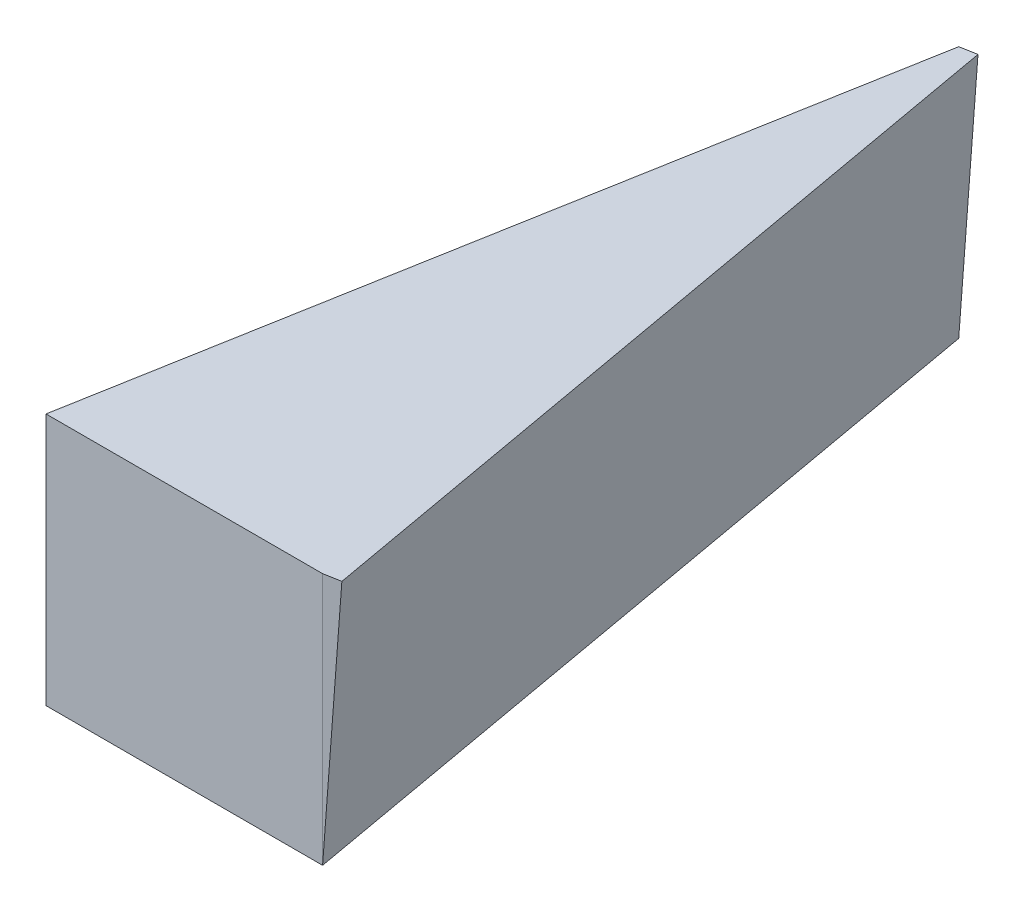
ISO-10303-21;
HEADER;
FILE_DESCRIPTION(('STEP AP214'),'2;1');
FILE_NAME('part.step','',(''),(''),'','','');
FILE_SCHEMA(('AUTOMOTIVE_DESIGN { 1 0 10303 214 1 1 1 1 }'));
ENDSEC;
DATA;
#1=APPLICATION_CONTEXT('core data for automotive mechanical design processes');
#2=APPLICATION_PROTOCOL_DEFINITION('international standard','automotive_design',2000,#1);
#3=PRODUCT_CONTEXT('',#1,'mechanical');
#4=PRODUCT('Part','Part','',(#3));
#5=PRODUCT_RELATED_PRODUCT_CATEGORY('part','',(#4));
#6=PRODUCT_DEFINITION_FORMATION('','',#4);
#7=PRODUCT_DEFINITION_CONTEXT('part definition',#1,'design');
#8=PRODUCT_DEFINITION('design','',#6,#7);
#9=PRODUCT_DEFINITION_SHAPE('','',#8);
#10=(LENGTH_UNIT() NAMED_UNIT(*) SI_UNIT(.MILLI.,.METRE.));
#11=(NAMED_UNIT(*) PLANE_ANGLE_UNIT() SI_UNIT($,.RADIAN.));
#12=(NAMED_UNIT(*) SI_UNIT($,.STERADIAN.) SOLID_ANGLE_UNIT());
#13=UNCERTAINTY_MEASURE_WITH_UNIT(LENGTH_MEASURE(1.E-05),#10,'distance_accuracy_value','');
#14=(GEOMETRIC_REPRESENTATION_CONTEXT(3) GLOBAL_UNCERTAINTY_ASSIGNED_CONTEXT((#13)) GLOBAL_UNIT_ASSIGNED_CONTEXT((#10,
#11,#12)) REPRESENTATION_CONTEXT('',''));
#15=CARTESIAN_POINT('',(0.,0.,0.));
#16=DIRECTION('',(0.,0.,1.));
#17=DIRECTION('',(1.,0.,0.));
#18=AXIS2_PLACEMENT_3D('',#15,#16,#17);
#19=CARTESIAN_POINT('',(0.,-65.09,0.));
#20=DIRECTION('',(0.,-1.,0.));
#21=DIRECTION('',(0.,0.,-1.));
#22=AXIS2_PLACEMENT_3D('',#19,#20,#21);
#23=PLANE('',#22);
#24=DIRECTION('',(-0.175798016675712,0.,-0.984426257945656));
#25=VECTOR('',#24,1.);
#26=CARTESIAN_POINT('',(71.265,-65.09,399.06671644601));
#27=LINE('',#26,#25);
#28=CARTESIAN_POINT('',(71.265,-65.09,399.06671644601));
#29=VERTEX_POINT('',#28);
#30=CARTESIAN_POINT('',(0.,-65.09,0.));
#31=VERTEX_POINT('',#30);
#32=EDGE_CURVE('E121',#29,#31,#27,.T.);
#33=ORIENTED_EDGE('',*,*,#32,.F.);
#34=DIRECTION('',(1.,0.,0.));
#35=VECTOR('',#34,1.);
#36=CARTESIAN_POINT('',(-71.265,-65.09,399.06671644601));
#37=LINE('',#36,#35);
#38=CARTESIAN_POINT('',(-71.265,-65.09,399.06671644601));
#39=VERTEX_POINT('',#38);
#40=EDGE_CURVE('E137',#39,#29,#37,.T.);
#41=ORIENTED_EDGE('',*,*,#40,.F.);
#42=DIRECTION('',(-0.175798016675712,0.,0.984426257945656));
#43=VECTOR('',#42,1.);
#44=CARTESIAN_POINT('',(0.,-65.09,0.));
#45=LINE('',#44,#43);
#46=EDGE_CURVE('E66',#31,#39,#45,.T.);
#47=ORIENTED_EDGE('',*,*,#46,.F.);
#48=EDGE_LOOP('',(#33,#41,#47));
#49=FACE_BOUND('',#48,.T.);
#50=DIRECTION('',(1.,0.,0.));
#51=VECTOR('',#50,1.);
#52=CARTESIAN_POINT('',(0.,-65.09,394.06671644601));
#53=LINE('',#52,#51);
#54=CARTESIAN_POINT('',(-65.2930035849032,-65.09,394.06671644601));
#55=VERTEX_POINT('',#54);
#56=CARTESIAN_POINT('',(65.2930035849032,-65.09,394.06671644601));
#57=VERTEX_POINT('',#56);
#58=EDGE_CURVE('E48',#55,#57,#53,.T.);
#59=ORIENTED_EDGE('',*,*,#58,.T.);
#60=DIRECTION('',(-0.175798016675712,0.,-0.984426257945656));
#61=VECTOR('',#60,1.);
#62=CARTESIAN_POINT('',(-4.92213128972828,-65.09,0.878990083378559));
#63=LINE('',#62,#61);
#64=CARTESIAN_POINT('',(0.,-65.09,28.4417315652845));
#65=VERTEX_POINT('',#64);
#66=EDGE_CURVE('E131',#57,#65,#63,.T.);
#67=ORIENTED_EDGE('',*,*,#66,.T.);
#68=DIRECTION('',(-0.175798016675712,0.,0.984426257945656));
#69=VECTOR('',#68,1.);
#70=CARTESIAN_POINT('',(4.92213128972828,-65.09,0.878990083378558));
#71=LINE('',#70,#69);
#72=EDGE_CURVE('E86',#65,#55,#71,.T.);
#73=ORIENTED_EDGE('',*,*,#72,.T.);
#74=EDGE_LOOP('',(#59,#67,#73));
#75=FACE_BOUND('',#74,.T.);
#76=ADVANCED_FACE('F33',(#49,#75),#23,.T.);
#77=CARTESIAN_POINT('',(0.,65.09,0.));
#78=DIRECTION('',(0.984426257945656,0.,0.175798016675712));
#79=DIRECTION('',(0.175798016675712,0.,-0.984426257945656));
#80=AXIS2_PLACEMENT_3D('',#77,#78,#79);
#81=PLANE('',#80);
#82=ORIENTED_EDGE('',*,*,#46,.T.);
#83=DIRECTION('',(0.,-1.,0.));
#84=VECTOR('',#83,1.);
#85=CARTESIAN_POINT('',(-71.265,65.09,399.06671644601));
#86=LINE('',#85,#84);
#87=CARTESIAN_POINT('',(-71.265,65.09,399.06671644601));
#88=VERTEX_POINT('',#87);
#89=EDGE_CURVE('E41',#88,#39,#86,.T.);
#90=ORIENTED_EDGE('',*,*,#89,.F.);
#91=DIRECTION('',(-0.175798016675712,0.,0.984426257945656));
#92=VECTOR('',#91,1.);
#93=CARTESIAN_POINT('',(0.,65.09,0.));
#94=LINE('',#93,#92);
#95=CARTESIAN_POINT('',(0.,65.09,0.));
#96=VERTEX_POINT('',#95);
#97=EDGE_CURVE('E57',#96,#88,#94,.T.);
#98=ORIENTED_EDGE('',*,*,#97,.F.);
#99=DIRECTION('',(0.,-1.,0.));
#100=VECTOR('',#99,1.);
#101=CARTESIAN_POINT('',(0.,65.09,0.));
#102=LINE('',#101,#100);
#103=EDGE_CURVE('E11',#96,#31,#102,.T.);
#104=ORIENTED_EDGE('',*,*,#103,.T.);
#105=EDGE_LOOP('',(#82,#90,#98,#104));
#106=FACE_BOUND('',#105,.T.);
#107=ADVANCED_FACE('F35',(#106),#81,.F.);
#108=CARTESIAN_POINT('',(-71.265,65.09,399.06671644601));
#109=DIRECTION('',(0.,0.,-1.));
#110=DIRECTION('',(-1.,0.,0.));
#111=AXIS2_PLACEMENT_3D('',#108,#109,#110);
#112=PLANE('',#111);
#113=ORIENTED_EDGE('',*,*,#40,.T.);
#114=DIRECTION('',(0.,-1.,0.));
#115=VECTOR('',#114,1.);
#116=CARTESIAN_POINT('',(71.265,65.09,399.06671644601));
#117=LINE('',#116,#115);
#118=CARTESIAN_POINT('',(71.265,65.09,399.06671644601));
#119=VERTEX_POINT('',#118);
#120=EDGE_CURVE('E138',#119,#29,#117,.T.);
#121=ORIENTED_EDGE('',*,*,#120,.F.);
#122=DIRECTION('',(1.,0.,0.));
#123=VECTOR('',#122,1.);
#124=CARTESIAN_POINT('',(-71.265,65.09,399.06671644601));
#125=LINE('',#124,#123);
#126=EDGE_CURVE('E136',#88,#119,#125,.T.);
#127=ORIENTED_EDGE('',*,*,#126,.F.);
#128=ORIENTED_EDGE('',*,*,#89,.T.);
#129=EDGE_LOOP('',(#113,#121,#127,#128));
#130=FACE_BOUND('',#129,.T.);
#131=ADVANCED_FACE('F146',(#130),#112,.F.);
#132=CARTESIAN_POINT('',(0.,65.09,0.));
#133=DIRECTION('',(0.,-1.,0.));
#134=DIRECTION('',(0.,0.,-1.));
#135=AXIS2_PLACEMENT_3D('',#132,#133,#134);
#136=PLANE('',#135);
#137=ORIENTED_EDGE('',*,*,#126,.T.);
#138=DIRECTION('',(-0.984426257945655,0.,0.175798016675712));
#139=VECTOR('',#138,1.);
#140=CARTESIAN_POINT('',(71.265,65.09,399.06671644601));
#141=LINE('',#140,#139);
#142=CARTESIAN_POINT('',(79.6921252681926,65.09,397.56180747343));
#143=VERTEX_POINT('',#142);
#144=EDGE_CURVE('E166',#143,#119,#141,.T.);
#145=ORIENTED_EDGE('',*,*,#144,.F.);
#146=DIRECTION('',(0.175798016675712,0.,0.984426257945655));
#147=VECTOR('',#146,1.);
#148=CARTESIAN_POINT('',(8.42712526819255,65.09,-1.50490897258032));
#149=LINE('',#148,#147);
#150=CARTESIAN_POINT('',(8.42712526819255,65.09,-1.50490897258032));
#151=VERTEX_POINT('',#150);
#152=EDGE_CURVE('E93',#151,#143,#149,.T.);
#153=ORIENTED_EDGE('',*,*,#152,.F.);
#154=DIRECTION('',(-0.984426257945655,0.,0.175798016675712));
#155=VECTOR('',#154,1.);
#156=CARTESIAN_POINT('',(0.,65.09,0.));
#157=LINE('',#156,#155);
#158=EDGE_CURVE('E162',#151,#96,#157,.T.);
#159=ORIENTED_EDGE('',*,*,#158,.T.);
#160=ORIENTED_EDGE('',*,*,#97,.T.);
#161=EDGE_LOOP('',(#137,#145,#153,#159,#160));
#162=FACE_BOUND('',#161,.T.);
#163=ADVANCED_FACE('F169',(#162),#136,.F.);
#164=CARTESIAN_POINT('',(66.3428687102717,65.09,399.945706529388));
#165=DIRECTION('',(-0.984426257945656,0.,0.175798016675712));
#166=DIRECTION('',(0.175798016675712,0.,0.984426257945656));
#167=AXIS2_PLACEMENT_3D('',#164,#165,#166);
#168=PLANE('',#167);
#169=ORIENTED_EDGE('',*,*,#66,.F.);
#170=DIRECTION('',(0.,-1.,0.));
#171=VECTOR('',#170,1.);
#172=CARTESIAN_POINT('',(65.2930035849032,65.09,394.06671644601));
#173=LINE('',#172,#171);
#174=CARTESIAN_POINT('',(65.2930035849032,60.09,394.06671644601));
#175=VERTEX_POINT('',#174);
#176=EDGE_CURVE('E118',#175,#57,#173,.T.);
#177=ORIENTED_EDGE('',*,*,#176,.F.);
#178=DIRECTION('',(-0.175798016675712,0.,-0.984426257945656));
#179=VECTOR('',#178,1.);
#180=CARTESIAN_POINT('',(-4.92213128972828,60.09,0.878990083378559));
#181=LINE('',#180,#179);
#182=CARTESIAN_POINT('',(0.,60.09,28.4417315652845));
#183=VERTEX_POINT('',#182);
#184=EDGE_CURVE('E111',#175,#183,#181,.T.);
#185=ORIENTED_EDGE('',*,*,#184,.T.);
#186=DIRECTION('',(0.,-1.,0.));
#187=VECTOR('',#186,1.);
#188=CARTESIAN_POINT('',(0.,65.09,28.4417315652845));
#189=LINE('',#188,#187);
#190=EDGE_CURVE('E116',#183,#65,#189,.T.);
#191=ORIENTED_EDGE('',*,*,#190,.T.);
#192=EDGE_LOOP('',(#169,#177,#185,#191));
#193=FACE_BOUND('',#192,.T.);
#194=ADVANCED_FACE('F115',(#193),#168,.T.);
#195=CARTESIAN_POINT('',(4.92213128972828,65.09,0.878990083378558));
#196=DIRECTION('',(0.984426257945656,0.,0.175798016675712));
#197=DIRECTION('',(0.175798016675712,0.,-0.984426257945656));
#198=AXIS2_PLACEMENT_3D('',#195,#196,#197);
#199=PLANE('',#198);
#200=ORIENTED_EDGE('',*,*,#72,.F.);
#201=ORIENTED_EDGE('',*,*,#190,.F.);
#202=DIRECTION('',(-0.175798016675712,0.,0.984426257945656));
#203=VECTOR('',#202,1.);
#204=CARTESIAN_POINT('',(4.92213128972828,60.09,0.878990083378558));
#205=LINE('',#204,#203);
#206=CARTESIAN_POINT('',(-65.2930035849032,60.09,394.06671644601));
#207=VERTEX_POINT('',#206);
#208=EDGE_CURVE('E108',#183,#207,#205,.T.);
#209=ORIENTED_EDGE('',*,*,#208,.T.);
#210=DIRECTION('',(0.,-1.,0.));
#211=VECTOR('',#210,1.);
#212=CARTESIAN_POINT('',(-65.2930035849032,65.09,394.06671644601));
#213=LINE('',#212,#211);
#214=EDGE_CURVE('E122',#207,#55,#213,.T.);
#215=ORIENTED_EDGE('',*,*,#214,.T.);
#216=EDGE_LOOP('',(#200,#201,#209,#215));
#217=FACE_BOUND('',#216,.T.);
#218=ADVANCED_FACE('F120',(#217),#199,.T.);
#219=CARTESIAN_POINT('',(-71.265,65.09,394.06671644601));
#220=DIRECTION('',(0.,0.,-1.));
#221=DIRECTION('',(-1.,0.,0.));
#222=AXIS2_PLACEMENT_3D('',#219,#220,#221);
#223=PLANE('',#222);
#224=ORIENTED_EDGE('',*,*,#58,.F.);
#225=ORIENTED_EDGE('',*,*,#214,.F.);
#226=DIRECTION('',(1.,0.,0.));
#227=VECTOR('',#226,1.);
#228=CARTESIAN_POINT('',(0.,60.09,394.06671644601));
#229=LINE('',#228,#227);
#230=EDGE_CURVE('E72',#207,#175,#229,.T.);
#231=ORIENTED_EDGE('',*,*,#230,.T.);
#232=ORIENTED_EDGE('',*,*,#176,.T.);
#233=EDGE_LOOP('',(#224,#225,#231,#232));
#234=FACE_BOUND('',#233,.T.);
#235=ADVANCED_FACE('F226',(#234),#223,.T.);
#236=CARTESIAN_POINT('',(0.,60.09,0.));
#237=DIRECTION('',(0.,-1.,0.));
#238=DIRECTION('',(0.,0.,-1.));
#239=AXIS2_PLACEMENT_3D('',#236,#237,#238);
#240=PLANE('',#239);
#241=ORIENTED_EDGE('',*,*,#184,.F.);
#242=ORIENTED_EDGE('',*,*,#230,.F.);
#243=ORIENTED_EDGE('',*,*,#208,.F.);
#244=EDGE_LOOP('',(#241,#242,#243));
#245=FACE_BOUND('',#244,.T.);
#246=ADVANCED_FACE('F110',(#245),#240,.T.);
#247=CARTESIAN_POINT('',(8.42712526819255,65.09,-1.50490897258032));
#248=DIRECTION('',(0.9823047166606,-0.0656167979494943,-0.175419153609842));
#249=DIRECTION('',(-0.175798016675712,0.,-0.984426257945656));
#250=AXIS2_PLACEMENT_3D('',#247,#248,#249);
#251=PLANE('',#250);
#252=DIRECTION('',(0.0645948988637968,0.997844895676104,-0.011535302940132));
#253=VECTOR('',#252,1.);
#254=CARTESIAN_POINT('',(79.6921252681926,65.09,397.56180747343));
#255=LINE('',#254,#253);
#256=EDGE_CURVE('E158',#29,#143,#255,.T.);
#257=ORIENTED_EDGE('',*,*,#256,.F.);
#258=ORIENTED_EDGE('',*,*,#32,.T.);
#259=DIRECTION('',(0.0645948988637968,0.997844895676104,-0.011535302940132));
#260=VECTOR('',#259,1.);
#261=CARTESIAN_POINT('',(8.42712526819255,65.09,-1.50490897258032));
#262=LINE('',#261,#260);
#263=EDGE_CURVE('E156',#31,#151,#262,.T.);
#264=ORIENTED_EDGE('',*,*,#263,.T.);
#265=ORIENTED_EDGE('',*,*,#152,.T.);
#266=EDGE_LOOP('',(#257,#258,#264,#265));
#267=FACE_BOUND('',#266,.T.);
#268=ADVANCED_FACE('F155',(#267),#251,.T.);
#269=CARTESIAN_POINT('',(2.35922392732846E-13,0.,0.));
#270=DIRECTION('',(-0.175798016675712,0.,-0.984426257945655));
#271=DIRECTION('',(-0.984426257945655,0.,0.175798016675712));
#272=AXIS2_PLACEMENT_3D('',#269,#270,#271);
#273=PLANE('',#272);
#274=ORIENTED_EDGE('',*,*,#158,.F.);
#275=ORIENTED_EDGE('',*,*,#263,.F.);
#276=ORIENTED_EDGE('',*,*,#103,.F.);
#277=EDGE_LOOP('',(#274,#275,#276));
#278=FACE_BOUND('',#277,.T.);
#279=ADVANCED_FACE('F161',(#278),#273,.T.);
#280=CARTESIAN_POINT('',(71.2650000000003,0.,399.06671644601));
#281=DIRECTION('',(-0.175798016675712,0.,-0.984426257945655));
#282=DIRECTION('',(-0.984426257945655,0.,0.175798016675712));
#283=AXIS2_PLACEMENT_3D('',#280,#281,#282);
#284=PLANE('',#283);
#285=ORIENTED_EDGE('',*,*,#144,.T.);
#286=ORIENTED_EDGE('',*,*,#120,.T.);
#287=ORIENTED_EDGE('',*,*,#256,.T.);
#288=EDGE_LOOP('',(#285,#286,#287));
#289=FACE_BOUND('',#288,.T.);
#290=ADVANCED_FACE('F168',(#289),#284,.F.);
#291=CLOSED_SHELL('',(#76,#107,#131,#163,#194,#218,#235,#246,#268,#279,#290));
#292=MANIFOLD_SOLID_BREP('B2',#291);
#293=ADVANCED_BREP_SHAPE_REPRESENTATION('',(#18,#292),#14);
#294=SHAPE_DEFINITION_REPRESENTATION(#9,#293);
ENDSEC;
END-ISO-10303-21;
